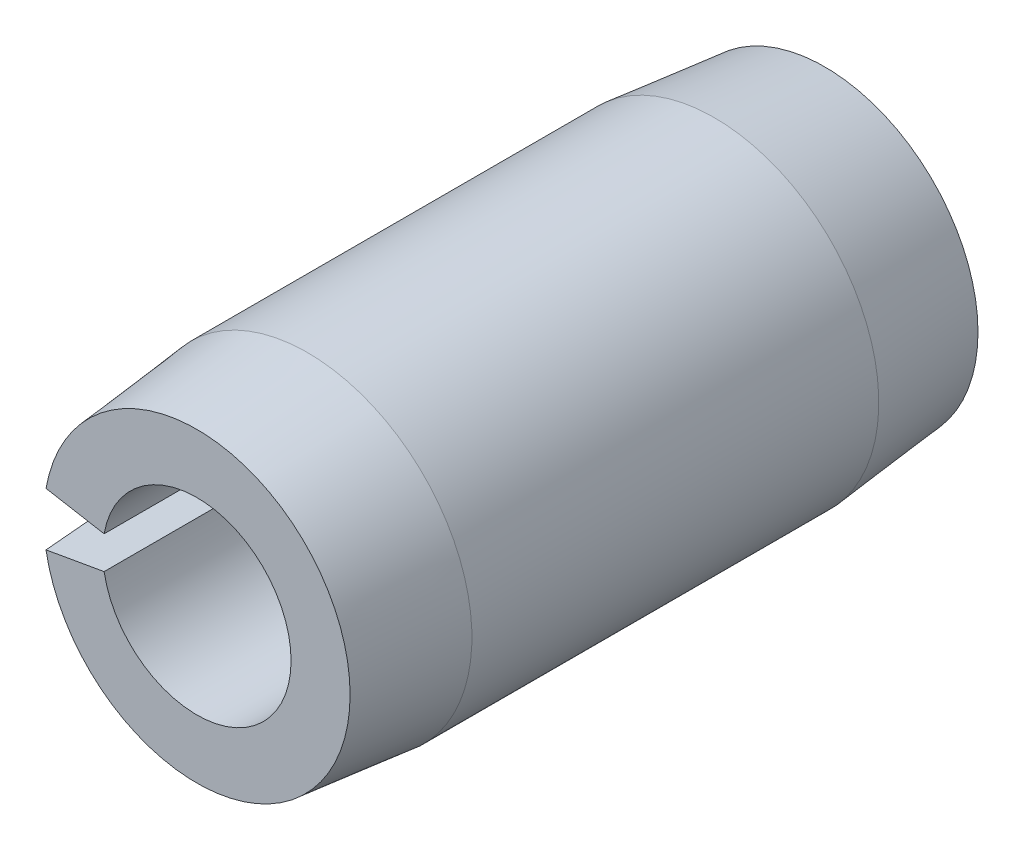
ISO-10303-21;
HEADER;
FILE_DESCRIPTION(('STEP AP214'),'2;1');
FILE_NAME('part.step','',(''),(''),'','','');
FILE_SCHEMA(('AUTOMOTIVE_DESIGN { 1 0 10303 214 1 1 1 1 }'));
ENDSEC;
DATA;
#1=APPLICATION_CONTEXT('core data for automotive mechanical design processes');
#2=APPLICATION_PROTOCOL_DEFINITION('international standard','automotive_design',2000,#1);
#3=PRODUCT_CONTEXT('',#1,'mechanical');
#4=PRODUCT('Part','Part','',(#3));
#5=PRODUCT_RELATED_PRODUCT_CATEGORY('part','',(#4));
#6=PRODUCT_DEFINITION_FORMATION('','',#4);
#7=PRODUCT_DEFINITION_CONTEXT('part definition',#1,'design');
#8=PRODUCT_DEFINITION('design','',#6,#7);
#9=PRODUCT_DEFINITION_SHAPE('','',#8);
#10=(LENGTH_UNIT() NAMED_UNIT(*) SI_UNIT(.MILLI.,.METRE.));
#11=(NAMED_UNIT(*) PLANE_ANGLE_UNIT() SI_UNIT($,.RADIAN.));
#12=(NAMED_UNIT(*) SI_UNIT($,.STERADIAN.) SOLID_ANGLE_UNIT());
#13=UNCERTAINTY_MEASURE_WITH_UNIT(LENGTH_MEASURE(1.E-05),#10,'distance_accuracy_value','');
#14=(GEOMETRIC_REPRESENTATION_CONTEXT(3) GLOBAL_UNCERTAINTY_ASSIGNED_CONTEXT((#13)) GLOBAL_UNIT_ASSIGNED_CONTEXT((#10,
#11,#12)) REPRESENTATION_CONTEXT('',''));
#15=CARTESIAN_POINT('',(0.,0.,0.));
#16=DIRECTION('',(0.,0.,1.));
#17=DIRECTION('',(1.,0.,0.));
#18=AXIS2_PLACEMENT_3D('',#15,#16,#17);
#19=CARTESIAN_POINT('',(0.,0.,3.175));
#20=DIRECTION('',(0.,0.,-1.));
#21=DIRECTION('',(-1.,0.,0.));
#22=AXIS2_PLACEMENT_3D('',#19,#20,#21);
#23=CYLINDRICAL_SURFACE('',#22,0.9525);
#24=CARTESIAN_POINT('',(0.,0.,-3.175));
#25=DIRECTION('',(0.,0.,-1.));
#26=DIRECTION('',(1.,0.,0.));
#27=AXIS2_PLACEMENT_3D('',#24,#25,#26);
#28=CIRCLE('',#27,0.9525);
#29=CARTESIAN_POINT('',(-0.938029384744129,0.165399889227748,-3.175));
#30=VERTEX_POINT('',#29);
#31=CARTESIAN_POINT('',(-0.938029384744129,-0.165399889227748,-3.175));
#32=VERTEX_POINT('',#31);
#33=EDGE_CURVE('E115',#30,#32,#28,.T.);
#34=ORIENTED_EDGE('',*,*,#33,.T.);
#35=DIRECTION('',(0.,0.,-1.));
#36=VECTOR('',#35,1.);
#37=CARTESIAN_POINT('',(-0.938029384744129,-0.165399889227748,3.175));
#38=LINE('',#37,#36);
#39=CARTESIAN_POINT('',(-0.938029384744129,-0.165399889227748,3.175));
#40=VERTEX_POINT('',#39);
#41=EDGE_CURVE('E11',#40,#32,#38,.T.);
#42=ORIENTED_EDGE('',*,*,#41,.F.);
#43=CARTESIAN_POINT('',(0.,0.,3.175));
#44=DIRECTION('',(0.,0.,-1.));
#45=DIRECTION('',(1.,0.,0.));
#46=AXIS2_PLACEMENT_3D('',#43,#44,#45);
#47=CIRCLE('',#46,0.9525);
#48=CARTESIAN_POINT('',(-0.938029384744129,0.165399889227748,3.175));
#49=VERTEX_POINT('',#48);
#50=EDGE_CURVE('E111',#49,#40,#47,.T.);
#51=ORIENTED_EDGE('',*,*,#50,.F.);
#52=DIRECTION('',(0.,0.,-1.));
#53=VECTOR('',#52,1.);
#54=CARTESIAN_POINT('',(-0.938029384744129,0.165399889227748,3.175));
#55=LINE('',#54,#53);
#56=EDGE_CURVE('E104',#49,#30,#55,.T.);
#57=ORIENTED_EDGE('',*,*,#56,.T.);
#58=EDGE_LOOP('',(#34,#42,#51,#57));
#59=FACE_BOUND('',#58,.T.);
#60=ADVANCED_FACE('F32',(#59),#23,.F.);
#61=CARTESIAN_POINT('',(-0.938029384744129,-0.165399889227748,3.175));
#62=DIRECTION('',(0.173648177666927,-0.984807753012209,0.));
#63=DIRECTION('',(0.984807753012209,0.173648177666927,0.));
#64=AXIS2_PLACEMENT_3D('',#61,#62,#63);
#65=PLANE('',#64);
#66=DIRECTION('',(0.,0.,-1.));
#67=VECTOR('',#66,1.);
#68=CARTESIAN_POINT('',(-1.63842465868641,-0.288898473184466,3.175));
#69=LINE('',#68,#67);
#70=CARTESIAN_POINT('',(-1.63842465868641,-0.288898473184467,2.0574));
#71=VERTEX_POINT('',#70);
#72=CARTESIAN_POINT('',(-1.63842465868641,-0.288898473184467,-2.0574));
#73=VERTEX_POINT('',#72);
#74=EDGE_CURVE('E39',#71,#73,#69,.T.);
#75=ORIENTED_EDGE('',*,*,#74,.F.);
#76=DIRECTION('',(-0.100196325582817,-0.0176673155681001,-0.99481081734183));
#77=VECTOR('',#76,1.);
#78=CARTESIAN_POINT('',(0.,0.,18.3246888888888));
#79=LINE('',#78,#77);
#80=CARTESIAN_POINT('',(-1.52586113251712,-0.269050486477137,3.175));
#81=VERTEX_POINT('',#80);
#82=EDGE_CURVE('E86',#71,#81,#79,.F.);
#83=ORIENTED_EDGE('',*,*,#82,.T.);
#84=DIRECTION('',(-0.984807753012209,-0.173648177666927,0.));
#85=VECTOR('',#84,1.);
#86=CARTESIAN_POINT('',(-0.938029384744129,-0.165399889227748,3.175));
#87=LINE('',#86,#85);
#88=EDGE_CURVE('E119',#40,#81,#87,.T.);
#89=ORIENTED_EDGE('',*,*,#88,.F.);
#90=ORIENTED_EDGE('',*,*,#41,.T.);
#91=DIRECTION('',(-0.984807753012209,-0.173648177666927,0.));
#92=VECTOR('',#91,1.);
#93=CARTESIAN_POINT('',(-0.938029384744129,-0.165399889227748,-3.175));
#94=LINE('',#93,#92);
#95=CARTESIAN_POINT('',(-1.52586113251712,-0.269050486477137,-3.175));
#96=VERTEX_POINT('',#95);
#97=EDGE_CURVE('E112',#32,#96,#94,.T.);
#98=ORIENTED_EDGE('',*,*,#97,.T.);
#99=DIRECTION('',(0.100196325582817,0.0176673155681001,-0.99481081734183));
#100=VECTOR('',#99,1.);
#101=CARTESIAN_POINT('',(0.,0.,-18.3246888888888));
#102=LINE('',#101,#100);
#103=EDGE_CURVE('E54',#96,#73,#102,.F.);
#104=ORIENTED_EDGE('',*,*,#103,.T.);
#105=EDGE_LOOP('',(#75,#83,#89,#90,#98,#104));
#106=FACE_BOUND('',#105,.T.);
#107=ADVANCED_FACE('F133',(#106),#65,.F.);
#108=CARTESIAN_POINT('',(0.,0.,3.175));
#109=DIRECTION('',(0.,0.,-1.));
#110=DIRECTION('',(-1.,0.,0.));
#111=AXIS2_PLACEMENT_3D('',#108,#109,#110);
#112=CYLINDRICAL_SURFACE('',#111,1.6637);
#113=DIRECTION('',(0.,0.,-1.));
#114=VECTOR('',#113,1.);
#115=CARTESIAN_POINT('',(-1.63842465868641,0.288898473184467,3.175));
#116=LINE('',#115,#114);
#117=CARTESIAN_POINT('',(-1.63842465868641,0.288898473184467,2.0574));
#118=VERTEX_POINT('',#117);
#119=CARTESIAN_POINT('',(-1.63842465868641,0.288898473184467,-2.0574));
#120=VERTEX_POINT('',#119);
#121=EDGE_CURVE('E96',#118,#120,#116,.T.);
#122=ORIENTED_EDGE('',*,*,#121,.F.);
#123=CARTESIAN_POINT('',(0.,0.,2.0574));
#124=DIRECTION('',(0.,0.,-1.));
#125=DIRECTION('',(-1.,0.,0.));
#126=AXIS2_PLACEMENT_3D('',#123,#124,#125);
#127=CIRCLE('',#126,1.6637);
#128=EDGE_CURVE('E83',#118,#71,#127,.T.);
#129=ORIENTED_EDGE('',*,*,#128,.T.);
#130=ORIENTED_EDGE('',*,*,#74,.T.);
#131=CARTESIAN_POINT('',(0.,0.,-2.0574));
#132=DIRECTION('',(0.,0.,-1.));
#133=DIRECTION('',(-1.,0.,0.));
#134=AXIS2_PLACEMENT_3D('',#131,#132,#133);
#135=CIRCLE('',#134,1.6637);
#136=EDGE_CURVE('E103',#120,#73,#135,.T.);
#137=ORIENTED_EDGE('',*,*,#136,.F.);
#138=EDGE_LOOP('',(#122,#129,#130,#137));
#139=FACE_BOUND('',#138,.T.);
#140=ADVANCED_FACE('F102',(#139),#112,.T.);
#141=CARTESIAN_POINT('',(-1.63842465868641,0.288898473184467,3.175));
#142=DIRECTION('',(0.173648177666927,0.984807753012209,0.));
#143=DIRECTION('',(-0.984807753012209,0.173648177666927,0.));
#144=AXIS2_PLACEMENT_3D('',#141,#142,#143);
#145=PLANE('',#144);
#146=DIRECTION('',(0.984807753012209,-0.173648177666927,0.));
#147=VECTOR('',#146,1.);
#148=CARTESIAN_POINT('',(-1.63842465868641,0.288898473184467,3.175));
#149=LINE('',#148,#147);
#150=CARTESIAN_POINT('',(-1.52586113251712,0.269050486477137,3.175));
#151=VERTEX_POINT('',#150);
#152=EDGE_CURVE('E99',#151,#49,#149,.T.);
#153=ORIENTED_EDGE('',*,*,#152,.F.);
#154=DIRECTION('',(0.100196325582817,-0.0176673155681001,0.99481081734183));
#155=VECTOR('',#154,1.);
#156=CARTESIAN_POINT('',(0.,0.,18.3246888888888));
#157=LINE('',#156,#155);
#158=EDGE_CURVE('E46',#151,#118,#157,.F.);
#159=ORIENTED_EDGE('',*,*,#158,.T.);
#160=ORIENTED_EDGE('',*,*,#121,.T.);
#161=DIRECTION('',(-0.100196325582817,0.0176673155681001,0.99481081734183));
#162=VECTOR('',#161,1.);
#163=CARTESIAN_POINT('',(0.,0.,-18.3246888888888));
#164=LINE('',#163,#162);
#165=CARTESIAN_POINT('',(-1.52586113251712,0.269050486477137,-3.175));
#166=VERTEX_POINT('',#165);
#167=EDGE_CURVE('E125',#120,#166,#164,.F.);
#168=ORIENTED_EDGE('',*,*,#167,.T.);
#169=DIRECTION('',(0.984807753012209,-0.173648177666927,0.));
#170=VECTOR('',#169,1.);
#171=CARTESIAN_POINT('',(-1.63842465868641,0.288898473184467,-3.175));
#172=LINE('',#171,#170);
#173=EDGE_CURVE('E109',#166,#30,#172,.T.);
#174=ORIENTED_EDGE('',*,*,#173,.T.);
#175=ORIENTED_EDGE('',*,*,#56,.F.);
#176=EDGE_LOOP('',(#153,#159,#160,#168,#174,#175));
#177=FACE_BOUND('',#176,.T.);
#178=ADVANCED_FACE('F94',(#177),#145,.F.);
#179=CARTESIAN_POINT('',(0.,0.,3.175));
#180=DIRECTION('',(0.,0.,1.));
#181=DIRECTION('',(1.,0.,0.));
#182=AXIS2_PLACEMENT_3D('',#179,#180,#181);
#183=PLANE('',#182);
#184=CARTESIAN_POINT('',(0.,0.,3.175));
#185=DIRECTION('',(0.,0.,-1.));
#186=DIRECTION('',(-1.,0.,0.));
#187=AXIS2_PLACEMENT_3D('',#184,#185,#186);
#188=CIRCLE('',#187,1.5494);
#189=EDGE_CURVE('E90',#151,#81,#188,.T.);
#190=ORIENTED_EDGE('',*,*,#189,.F.);
#191=ORIENTED_EDGE('',*,*,#152,.T.);
#192=ORIENTED_EDGE('',*,*,#50,.T.);
#193=ORIENTED_EDGE('',*,*,#88,.T.);
#194=EDGE_LOOP('',(#190,#191,#192,#193));
#195=FACE_BOUND('',#194,.T.);
#196=ADVANCED_FACE('F134',(#195),#183,.T.);
#197=CARTESIAN_POINT('',(0.,0.,-3.175));
#198=DIRECTION('',(0.,0.,1.));
#199=DIRECTION('',(1.,0.,0.));
#200=AXIS2_PLACEMENT_3D('',#197,#198,#199);
#201=PLANE('',#200);
#202=ORIENTED_EDGE('',*,*,#173,.F.);
#203=CARTESIAN_POINT('',(0.,0.,-3.175));
#204=DIRECTION('',(0.,0.,-1.));
#205=DIRECTION('',(-1.,0.,0.));
#206=AXIS2_PLACEMENT_3D('',#203,#204,#205);
#207=CIRCLE('',#206,1.5494);
#208=EDGE_CURVE('E127',#166,#96,#207,.T.);
#209=ORIENTED_EDGE('',*,*,#208,.T.);
#210=ORIENTED_EDGE('',*,*,#97,.F.);
#211=ORIENTED_EDGE('',*,*,#33,.F.);
#212=EDGE_LOOP('',(#202,#209,#210,#211));
#213=FACE_BOUND('',#212,.T.);
#214=ADVANCED_FACE('F141',(#213),#201,.F.);
#215=CARTESIAN_POINT('',(0.,0.,-2.0574));
#216=DIRECTION('',(0.,0.,1.));
#217=DIRECTION('',(1.,0.,0.));
#218=AXIS2_PLACEMENT_3D('',#215,#216,#217);
#219=CONICAL_SURFACE('',#218,1.6637,0.101918367480875);
#220=ORIENTED_EDGE('',*,*,#208,.F.);
#221=ORIENTED_EDGE('',*,*,#167,.F.);
#222=ORIENTED_EDGE('',*,*,#136,.T.);
#223=ORIENTED_EDGE('',*,*,#103,.F.);
#224=EDGE_LOOP('',(#220,#221,#222,#223));
#225=FACE_BOUND('',#224,.T.);
#226=ADVANCED_FACE('F142',(#225),#219,.T.);
#227=CARTESIAN_POINT('',(0.,0.,3.175));
#228=DIRECTION('',(0.,0.,-1.));
#229=DIRECTION('',(-1.,0.,0.));
#230=AXIS2_PLACEMENT_3D('',#227,#228,#229);
#231=CONICAL_SURFACE('',#230,1.5494,0.101918367480875);
#232=ORIENTED_EDGE('',*,*,#128,.F.);
#233=ORIENTED_EDGE('',*,*,#158,.F.);
#234=ORIENTED_EDGE('',*,*,#189,.T.);
#235=ORIENTED_EDGE('',*,*,#82,.F.);
#236=EDGE_LOOP('',(#232,#233,#234,#235));
#237=FACE_BOUND('',#236,.T.);
#238=ADVANCED_FACE('F84',(#237),#231,.T.);
#239=CLOSED_SHELL('',(#60,#107,#140,#178,#196,#214,#226,#238));
#240=MANIFOLD_SOLID_BREP('B2',#239);
#241=ADVANCED_BREP_SHAPE_REPRESENTATION('',(#18,#240),#14);
#242=SHAPE_DEFINITION_REPRESENTATION(#9,#241);
ENDSEC;
END-ISO-10303-21;
